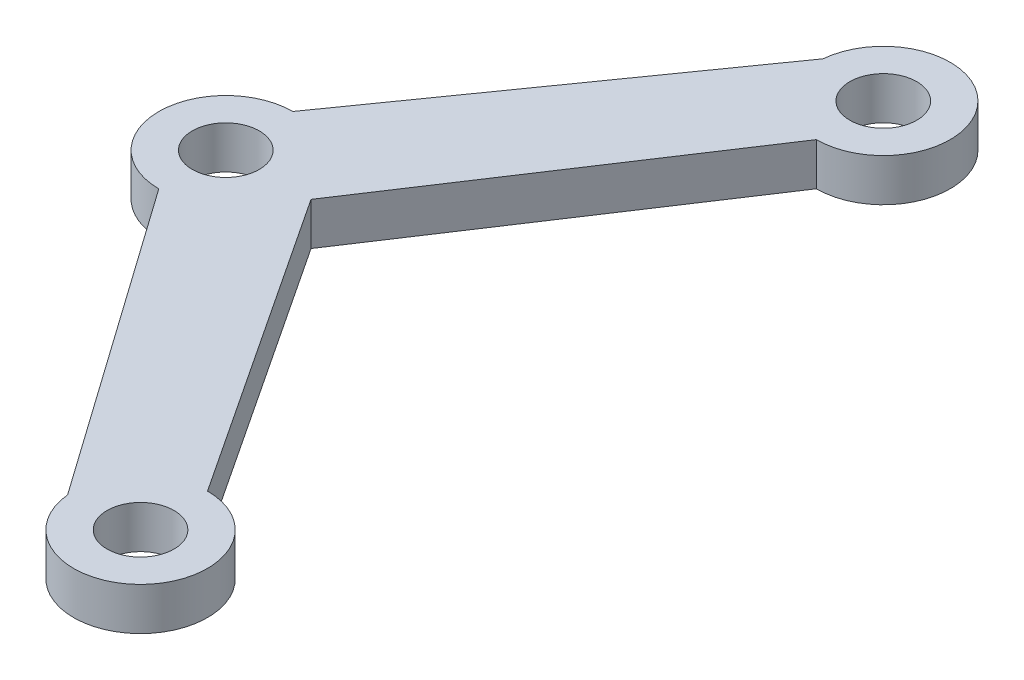
ISO-10303-21;
HEADER;
FILE_DESCRIPTION(('STEP AP214'),'2;1');
FILE_NAME('part.step','',(''),(''),'','','');
FILE_SCHEMA(('AUTOMOTIVE_DESIGN { 1 0 10303 214 1 1 1 1 }'));
ENDSEC;
DATA;
#1=APPLICATION_CONTEXT('core data for automotive mechanical design processes');
#2=APPLICATION_PROTOCOL_DEFINITION('international standard','automotive_design',2000,#1);
#3=PRODUCT_CONTEXT('',#1,'mechanical');
#4=PRODUCT('Part','Part','',(#3));
#5=PRODUCT_RELATED_PRODUCT_CATEGORY('part','',(#4));
#6=PRODUCT_DEFINITION_FORMATION('','',#4);
#7=PRODUCT_DEFINITION_CONTEXT('part definition',#1,'design');
#8=PRODUCT_DEFINITION('design','',#6,#7);
#9=PRODUCT_DEFINITION_SHAPE('','',#8);
#10=(LENGTH_UNIT() NAMED_UNIT(*) SI_UNIT(.MILLI.,.METRE.));
#11=(NAMED_UNIT(*) PLANE_ANGLE_UNIT() SI_UNIT($,.RADIAN.));
#12=(NAMED_UNIT(*) SI_UNIT($,.STERADIAN.) SOLID_ANGLE_UNIT());
#13=UNCERTAINTY_MEASURE_WITH_UNIT(LENGTH_MEASURE(1.E-05),#10,'distance_accuracy_value','');
#14=(GEOMETRIC_REPRESENTATION_CONTEXT(3) GLOBAL_UNCERTAINTY_ASSIGNED_CONTEXT((#13)) GLOBAL_UNIT_ASSIGNED_CONTEXT((#10,
#11,#12)) REPRESENTATION_CONTEXT('',''));
#15=CARTESIAN_POINT('',(0.,0.,0.));
#16=DIRECTION('',(0.,0.,1.));
#17=DIRECTION('',(1.,0.,0.));
#18=AXIS2_PLACEMENT_3D('',#15,#16,#17);
#19=CARTESIAN_POINT('',(-15.25,1.75,15.25));
#20=DIRECTION('',(0.,1.,0.));
#21=DIRECTION('',(0.,0.,1.));
#22=AXIS2_PLACEMENT_3D('',#19,#20,#21);
#23=PLANE('',#22);
#24=CARTESIAN_POINT('',(-27.,1.75,0.));
#25=DIRECTION('',(0.,1.,0.));
#26=DIRECTION('',(0.,0.,1.));
#27=AXIS2_PLACEMENT_3D('',#24,#25,#26);
#28=CIRCLE('',#27,1.375);
#29=CARTESIAN_POINT('',(-27.,1.75,1.375));
#30=VERTEX_POINT('',#29);
#31=EDGE_CURVE('E172',#30,#30,#28,.T.);
#32=ORIENTED_EDGE('',*,*,#31,.F.);
#33=EDGE_LOOP('',(#32));
#34=FACE_BOUND('',#33,.T.);
#35=CARTESIAN_POINT('',(-15.25,1.75,15.25));
#36=DIRECTION('',(0.,1.,0.));
#37=DIRECTION('',(0.,0.,1.));
#38=AXIS2_PLACEMENT_3D('',#35,#36,#37);
#39=CIRCLE('',#38,2.75);
#40=CARTESIAN_POINT('',(-17.9877734334544,1.75,15.5090301663348));
#41=VERTEX_POINT('',#40);
#42=CARTESIAN_POINT('',(-15.25,1.75,12.5));
#43=VERTEX_POINT('',#42);
#44=EDGE_CURVE('E145',#41,#43,#39,.T.);
#45=ORIENTED_EDGE('',*,*,#44,.T.);
#46=DIRECTION('',(-0.550842208330739,0.,-0.834609406561725));
#47=VECTOR('',#46,1.);
#48=CARTESIAN_POINT('',(-15.25,1.75,12.5));
#49=LINE('',#48,#47);
#50=CARTESIAN_POINT('',(-23.5,1.75,0.));
#51=VERTEX_POINT('',#50);
#52=EDGE_CURVE('E98',#43,#51,#49,.T.);
#53=ORIENTED_EDGE('',*,*,#52,.T.);
#54=DIRECTION('',(0.550842208330739,0.,-0.834609406561725));
#55=VECTOR('',#54,1.);
#56=CARTESIAN_POINT('',(-15.25,1.75,-12.5));
#57=LINE('',#56,#55);
#58=CARTESIAN_POINT('',(-15.25,1.75,-12.5));
#59=VERTEX_POINT('',#58);
#60=EDGE_CURVE('E157',#51,#59,#57,.T.);
#61=ORIENTED_EDGE('',*,*,#60,.T.);
#62=CARTESIAN_POINT('',(-15.25,1.75,-15.25));
#63=DIRECTION('',(0.,1.,0.));
#64=DIRECTION('',(0.,0.,1.));
#65=AXIS2_PLACEMENT_3D('',#62,#63,#64);
#66=CIRCLE('',#65,2.75);
#67=CARTESIAN_POINT('',(-17.9877734334544,1.75,-15.5090301663348));
#68=VERTEX_POINT('',#67);
#69=EDGE_CURVE('E114',#59,#68,#66,.T.);
#70=ORIENTED_EDGE('',*,*,#69,.T.);
#71=DIRECTION('',(-0.57693322372587,0.,0.8167913168988));
#72=VECTOR('',#71,1.);
#73=CARTESIAN_POINT('',(-17.9877734334544,1.75,-15.5090301663348));
#74=LINE('',#73,#72);
#75=CARTESIAN_POINT('',(-27.,1.75,-2.75));
#76=VERTEX_POINT('',#75);
#77=EDGE_CURVE('E108',#68,#76,#74,.T.);
#78=ORIENTED_EDGE('',*,*,#77,.T.);
#79=CARTESIAN_POINT('',(-27.,1.75,0.));
#80=DIRECTION('',(0.,1.,0.));
#81=DIRECTION('',(0.,0.,1.));
#82=AXIS2_PLACEMENT_3D('',#79,#80,#81);
#83=CIRCLE('',#82,2.75);
#84=CARTESIAN_POINT('',(-27.,1.75,2.75));
#85=VERTEX_POINT('',#84);
#86=EDGE_CURVE('E112',#76,#85,#83,.T.);
#87=ORIENTED_EDGE('',*,*,#86,.T.);
#88=DIRECTION('',(0.57693322372587,0.,0.8167913168988));
#89=VECTOR('',#88,1.);
#90=CARTESIAN_POINT('',(-27.,1.75,2.75));
#91=LINE('',#90,#89);
#92=EDGE_CURVE('E58',#85,#41,#91,.T.);
#93=ORIENTED_EDGE('',*,*,#92,.T.);
#94=EDGE_LOOP('',(#45,#53,#61,#70,#78,#87,#93));
#95=FACE_BOUND('',#94,.T.);
#96=CARTESIAN_POINT('',(-15.25,1.75,-15.25));
#97=DIRECTION('',(0.,1.,0.));
#98=DIRECTION('',(0.,0.,1.));
#99=AXIS2_PLACEMENT_3D('',#96,#97,#98);
#100=CIRCLE('',#99,1.375);
#101=CARTESIAN_POINT('',(-15.25,1.75,-13.875));
#102=VERTEX_POINT('',#101);
#103=EDGE_CURVE('E136',#102,#102,#100,.T.);
#104=ORIENTED_EDGE('',*,*,#103,.F.);
#105=EDGE_LOOP('',(#104));
#106=FACE_BOUND('',#105,.T.);
#107=CARTESIAN_POINT('',(-15.25,1.75,15.25));
#108=DIRECTION('',(0.,1.,0.));
#109=DIRECTION('',(0.,0.,1.));
#110=AXIS2_PLACEMENT_3D('',#107,#108,#109);
#111=CIRCLE('',#110,1.375);
#112=CARTESIAN_POINT('',(-15.25,1.75,16.625));
#113=VERTEX_POINT('',#112);
#114=EDGE_CURVE('E178',#113,#113,#111,.T.);
#115=ORIENTED_EDGE('',*,*,#114,.F.);
#116=EDGE_LOOP('',(#115));
#117=FACE_BOUND('',#116,.T.);
#118=ADVANCED_FACE('F41',(#34,#95,#106,#117),#23,.T.);
#119=CARTESIAN_POINT('',(-15.25,0.,15.25));
#120=DIRECTION('',(0.,1.,0.));
#121=DIRECTION('',(0.,0.,1.));
#122=AXIS2_PLACEMENT_3D('',#119,#120,#121);
#123=PLANE('',#122);
#124=CARTESIAN_POINT('',(-15.25,0.,15.25));
#125=DIRECTION('',(0.,1.,0.));
#126=DIRECTION('',(0.,0.,1.));
#127=AXIS2_PLACEMENT_3D('',#124,#125,#126);
#128=CIRCLE('',#127,2.75);
#129=CARTESIAN_POINT('',(-17.9877734334544,0.,15.5090301663348));
#130=VERTEX_POINT('',#129);
#131=CARTESIAN_POINT('',(-15.25,0.,12.5));
#132=VERTEX_POINT('',#131);
#133=EDGE_CURVE('E132',#130,#132,#128,.T.);
#134=ORIENTED_EDGE('',*,*,#133,.F.);
#135=DIRECTION('',(0.57693322372587,0.,0.8167913168988));
#136=VECTOR('',#135,1.);
#137=CARTESIAN_POINT('',(-27.,0.,2.75));
#138=LINE('',#137,#136);
#139=CARTESIAN_POINT('',(-27.,0.,2.75));
#140=VERTEX_POINT('',#139);
#141=EDGE_CURVE('E90',#140,#130,#138,.T.);
#142=ORIENTED_EDGE('',*,*,#141,.F.);
#143=CARTESIAN_POINT('',(-27.,0.,0.));
#144=DIRECTION('',(0.,1.,0.));
#145=DIRECTION('',(0.,0.,1.));
#146=AXIS2_PLACEMENT_3D('',#143,#144,#145);
#147=CIRCLE('',#146,2.75);
#148=CARTESIAN_POINT('',(-27.,0.,-2.75));
#149=VERTEX_POINT('',#148);
#150=EDGE_CURVE('E84',#149,#140,#147,.T.);
#151=ORIENTED_EDGE('',*,*,#150,.F.);
#152=DIRECTION('',(-0.57693322372587,0.,0.8167913168988));
#153=VECTOR('',#152,1.);
#154=CARTESIAN_POINT('',(-17.9877734334544,0.,-15.5090301663348));
#155=LINE('',#154,#153);
#156=CARTESIAN_POINT('',(-17.9877734334544,0.,-15.5090301663348));
#157=VERTEX_POINT('',#156);
#158=EDGE_CURVE('E122',#157,#149,#155,.T.);
#159=ORIENTED_EDGE('',*,*,#158,.F.);
#160=CARTESIAN_POINT('',(-15.25,0.,-15.25));
#161=DIRECTION('',(0.,1.,0.));
#162=DIRECTION('',(0.,0.,1.));
#163=AXIS2_PLACEMENT_3D('',#160,#161,#162);
#164=CIRCLE('',#163,2.75);
#165=CARTESIAN_POINT('',(-15.25,0.,-12.5));
#166=VERTEX_POINT('',#165);
#167=EDGE_CURVE('E140',#166,#157,#164,.T.);
#168=ORIENTED_EDGE('',*,*,#167,.F.);
#169=DIRECTION('',(0.550842208330739,0.,-0.834609406561725));
#170=VECTOR('',#169,1.);
#171=CARTESIAN_POINT('',(-15.25,0.,-12.5));
#172=LINE('',#171,#170);
#173=CARTESIAN_POINT('',(-23.5,0.,0.));
#174=VERTEX_POINT('',#173);
#175=EDGE_CURVE('E138',#174,#166,#172,.T.);
#176=ORIENTED_EDGE('',*,*,#175,.F.);
#177=DIRECTION('',(-0.550842208330739,0.,-0.834609406561725));
#178=VECTOR('',#177,1.);
#179=CARTESIAN_POINT('',(-15.25,0.,12.5));
#180=LINE('',#179,#178);
#181=EDGE_CURVE('E135',#132,#174,#180,.T.);
#182=ORIENTED_EDGE('',*,*,#181,.F.);
#183=EDGE_LOOP('',(#134,#142,#151,#159,#168,#176,#182));
#184=FACE_BOUND('',#183,.T.);
#185=CARTESIAN_POINT('',(-15.25,0.,-15.25));
#186=DIRECTION('',(0.,1.,0.));
#187=DIRECTION('',(0.,0.,1.));
#188=AXIS2_PLACEMENT_3D('',#185,#186,#187);
#189=CIRCLE('',#188,1.375);
#190=CARTESIAN_POINT('',(-15.25,0.,-13.875));
#191=VERTEX_POINT('',#190);
#192=EDGE_CURVE('E169',#191,#191,#189,.T.);
#193=ORIENTED_EDGE('',*,*,#192,.T.);
#194=EDGE_LOOP('',(#193));
#195=FACE_BOUND('',#194,.T.);
#196=CARTESIAN_POINT('',(-27.,0.,0.));
#197=DIRECTION('',(0.,1.,0.));
#198=DIRECTION('',(0.,0.,1.));
#199=AXIS2_PLACEMENT_3D('',#196,#197,#198);
#200=CIRCLE('',#199,1.375);
#201=CARTESIAN_POINT('',(-27.,0.,1.375));
#202=VERTEX_POINT('',#201);
#203=EDGE_CURVE('E175',#202,#202,#200,.T.);
#204=ORIENTED_EDGE('',*,*,#203,.T.);
#205=EDGE_LOOP('',(#204));
#206=FACE_BOUND('',#205,.T.);
#207=CARTESIAN_POINT('',(-15.25,0.,15.25));
#208=DIRECTION('',(0.,1.,0.));
#209=DIRECTION('',(0.,0.,1.));
#210=AXIS2_PLACEMENT_3D('',#207,#208,#209);
#211=CIRCLE('',#210,1.375);
#212=CARTESIAN_POINT('',(-15.25,0.,16.625));
#213=VERTEX_POINT('',#212);
#214=EDGE_CURVE('E181',#213,#213,#211,.T.);
#215=ORIENTED_EDGE('',*,*,#214,.T.);
#216=EDGE_LOOP('',(#215));
#217=FACE_BOUND('',#216,.T.);
#218=ADVANCED_FACE('F161',(#184,#195,#206,#217),#123,.F.);
#219=CARTESIAN_POINT('',(-15.25,1.75,15.25));
#220=DIRECTION('',(0.,-1.,0.));
#221=DIRECTION('',(0.,0.,-1.));
#222=AXIS2_PLACEMENT_3D('',#219,#220,#221);
#223=CYLINDRICAL_SURFACE('',#222,2.75);
#224=ORIENTED_EDGE('',*,*,#133,.T.);
#225=DIRECTION('',(0.,-1.,0.));
#226=VECTOR('',#225,1.);
#227=CARTESIAN_POINT('',(-15.25,1.75,12.5));
#228=LINE('',#227,#226);
#229=EDGE_CURVE('E11',#43,#132,#228,.T.);
#230=ORIENTED_EDGE('',*,*,#229,.F.);
#231=ORIENTED_EDGE('',*,*,#44,.F.);
#232=DIRECTION('',(0.,-1.,0.));
#233=VECTOR('',#232,1.);
#234=CARTESIAN_POINT('',(-17.9877734334544,1.75,15.5090301663348));
#235=LINE('',#234,#233);
#236=EDGE_CURVE('E128',#41,#130,#235,.T.);
#237=ORIENTED_EDGE('',*,*,#236,.T.);
#238=EDGE_LOOP('',(#224,#230,#231,#237));
#239=FACE_BOUND('',#238,.T.);
#240=ADVANCED_FACE('F43',(#239),#223,.T.);
#241=CARTESIAN_POINT('',(-15.25,1.75,12.5));
#242=DIRECTION('',(-0.834609406561725,0.,0.550842208330739));
#243=DIRECTION('',(0.550842208330739,0.,0.834609406561725));
#244=AXIS2_PLACEMENT_3D('',#241,#242,#243);
#245=PLANE('',#244);
#246=ORIENTED_EDGE('',*,*,#181,.T.);
#247=DIRECTION('',(0.,-1.,0.));
#248=VECTOR('',#247,1.);
#249=CARTESIAN_POINT('',(-23.5,1.75,0.));
#250=LINE('',#249,#248);
#251=EDGE_CURVE('E50',#51,#174,#250,.T.);
#252=ORIENTED_EDGE('',*,*,#251,.F.);
#253=ORIENTED_EDGE('',*,*,#52,.F.);
#254=ORIENTED_EDGE('',*,*,#229,.T.);
#255=EDGE_LOOP('',(#246,#252,#253,#254));
#256=FACE_BOUND('',#255,.T.);
#257=ADVANCED_FACE('F212',(#256),#245,.F.);
#258=CARTESIAN_POINT('',(-15.25,1.75,-12.5));
#259=DIRECTION('',(-0.834609406561725,0.,-0.550842208330739));
#260=DIRECTION('',(-0.550842208330739,0.,0.834609406561725));
#261=AXIS2_PLACEMENT_3D('',#258,#259,#260);
#262=PLANE('',#261);
#263=ORIENTED_EDGE('',*,*,#175,.T.);
#264=DIRECTION('',(0.,-1.,0.));
#265=VECTOR('',#264,1.);
#266=CARTESIAN_POINT('',(-15.25,1.75,-12.5));
#267=LINE('',#266,#265);
#268=EDGE_CURVE('E149',#59,#166,#267,.T.);
#269=ORIENTED_EDGE('',*,*,#268,.F.);
#270=ORIENTED_EDGE('',*,*,#60,.F.);
#271=ORIENTED_EDGE('',*,*,#251,.T.);
#272=EDGE_LOOP('',(#263,#269,#270,#271));
#273=FACE_BOUND('',#272,.T.);
#274=ADVANCED_FACE('F155',(#273),#262,.F.);
#275=CARTESIAN_POINT('',(-15.25,1.75,-15.25));
#276=DIRECTION('',(0.,-1.,0.));
#277=DIRECTION('',(0.,0.,-1.));
#278=AXIS2_PLACEMENT_3D('',#275,#276,#277);
#279=CYLINDRICAL_SURFACE('',#278,2.75);
#280=ORIENTED_EDGE('',*,*,#167,.T.);
#281=DIRECTION('',(0.,-1.,0.));
#282=VECTOR('',#281,1.);
#283=CARTESIAN_POINT('',(-17.9877734334544,1.75,-15.5090301663348));
#284=LINE('',#283,#282);
#285=EDGE_CURVE('E123',#68,#157,#284,.T.);
#286=ORIENTED_EDGE('',*,*,#285,.F.);
#287=ORIENTED_EDGE('',*,*,#69,.F.);
#288=ORIENTED_EDGE('',*,*,#268,.T.);
#289=EDGE_LOOP('',(#280,#286,#287,#288));
#290=FACE_BOUND('',#289,.T.);
#291=ADVANCED_FACE('F164',(#290),#279,.T.);
#292=CARTESIAN_POINT('',(-17.9877734334544,1.75,-15.5090301663348));
#293=DIRECTION('',(0.8167913168988,0.,0.57693322372587));
#294=DIRECTION('',(0.57693322372587,0.,-0.8167913168988));
#295=AXIS2_PLACEMENT_3D('',#292,#293,#294);
#296=PLANE('',#295);
#297=ORIENTED_EDGE('',*,*,#158,.T.);
#298=DIRECTION('',(0.,-1.,0.));
#299=VECTOR('',#298,1.);
#300=CARTESIAN_POINT('',(-27.,1.75,-2.75));
#301=LINE('',#300,#299);
#302=EDGE_CURVE('E119',#76,#149,#301,.T.);
#303=ORIENTED_EDGE('',*,*,#302,.F.);
#304=ORIENTED_EDGE('',*,*,#77,.F.);
#305=ORIENTED_EDGE('',*,*,#285,.T.);
#306=EDGE_LOOP('',(#297,#303,#304,#305));
#307=FACE_BOUND('',#306,.T.);
#308=ADVANCED_FACE('F120',(#307),#296,.F.);
#309=CARTESIAN_POINT('',(-27.,1.75,0.));
#310=DIRECTION('',(0.,-1.,0.));
#311=DIRECTION('',(0.,0.,-1.));
#312=AXIS2_PLACEMENT_3D('',#309,#310,#311);
#313=CYLINDRICAL_SURFACE('',#312,2.75);
#314=ORIENTED_EDGE('',*,*,#150,.T.);
#315=DIRECTION('',(0.,-1.,0.));
#316=VECTOR('',#315,1.);
#317=CARTESIAN_POINT('',(-27.,1.75,2.75));
#318=LINE('',#317,#316);
#319=EDGE_CURVE('E124',#85,#140,#318,.T.);
#320=ORIENTED_EDGE('',*,*,#319,.F.);
#321=ORIENTED_EDGE('',*,*,#86,.F.);
#322=ORIENTED_EDGE('',*,*,#302,.T.);
#323=EDGE_LOOP('',(#314,#320,#321,#322));
#324=FACE_BOUND('',#323,.T.);
#325=ADVANCED_FACE('F126',(#324),#313,.T.);
#326=CARTESIAN_POINT('',(-27.,1.75,2.75));
#327=DIRECTION('',(0.8167913168988,0.,-0.57693322372587));
#328=DIRECTION('',(-0.57693322372587,0.,-0.8167913168988));
#329=AXIS2_PLACEMENT_3D('',#326,#327,#328);
#330=PLANE('',#329);
#331=ORIENTED_EDGE('',*,*,#141,.T.);
#332=ORIENTED_EDGE('',*,*,#236,.F.);
#333=ORIENTED_EDGE('',*,*,#92,.F.);
#334=ORIENTED_EDGE('',*,*,#319,.T.);
#335=EDGE_LOOP('',(#331,#332,#333,#334));
#336=FACE_BOUND('',#335,.T.);
#337=ADVANCED_FACE('F202',(#336),#330,.F.);
#338=CARTESIAN_POINT('',(-15.25,1.75,-15.25));
#339=DIRECTION('',(0.,-1.,0.));
#340=DIRECTION('',(0.,0.,-1.));
#341=AXIS2_PLACEMENT_3D('',#338,#339,#340);
#342=CYLINDRICAL_SURFACE('',#341,1.375);
#343=ORIENTED_EDGE('',*,*,#103,.T.);
#344=EDGE_LOOP('',(#343));
#345=FACE_BOUND('',#344,.T.);
#346=ORIENTED_EDGE('',*,*,#192,.F.);
#347=EDGE_LOOP('',(#346));
#348=FACE_BOUND('',#347,.T.);
#349=ADVANCED_FACE('F199',(#345,#348),#342,.F.);
#350=CARTESIAN_POINT('',(-27.,1.75,0.));
#351=DIRECTION('',(0.,-1.,0.));
#352=DIRECTION('',(0.,0.,-1.));
#353=AXIS2_PLACEMENT_3D('',#350,#351,#352);
#354=CYLINDRICAL_SURFACE('',#353,1.375);
#355=ORIENTED_EDGE('',*,*,#31,.T.);
#356=EDGE_LOOP('',(#355));
#357=FACE_BOUND('',#356,.T.);
#358=ORIENTED_EDGE('',*,*,#203,.F.);
#359=EDGE_LOOP('',(#358));
#360=FACE_BOUND('',#359,.T.);
#361=ADVANCED_FACE('F270',(#357,#360),#354,.F.);
#362=CARTESIAN_POINT('',(-15.25,1.75,15.25));
#363=DIRECTION('',(0.,-1.,0.));
#364=DIRECTION('',(0.,0.,-1.));
#365=AXIS2_PLACEMENT_3D('',#362,#363,#364);
#366=CYLINDRICAL_SURFACE('',#365,1.375);
#367=ORIENTED_EDGE('',*,*,#114,.T.);
#368=EDGE_LOOP('',(#367));
#369=FACE_BOUND('',#368,.T.);
#370=ORIENTED_EDGE('',*,*,#214,.F.);
#371=EDGE_LOOP('',(#370));
#372=FACE_BOUND('',#371,.T.);
#373=ADVANCED_FACE('F187',(#369,#372),#366,.F.);
#374=CLOSED_SHELL('',(#118,#218,#240,#257,#274,#291,#308,#325,#337,#349,#361,#373));
#375=MANIFOLD_SOLID_BREP('B2',#374);
#376=ADVANCED_BREP_SHAPE_REPRESENTATION('',(#18,#375),#14);
#377=SHAPE_DEFINITION_REPRESENTATION(#9,#376);
ENDSEC;
END-ISO-10303-21;
